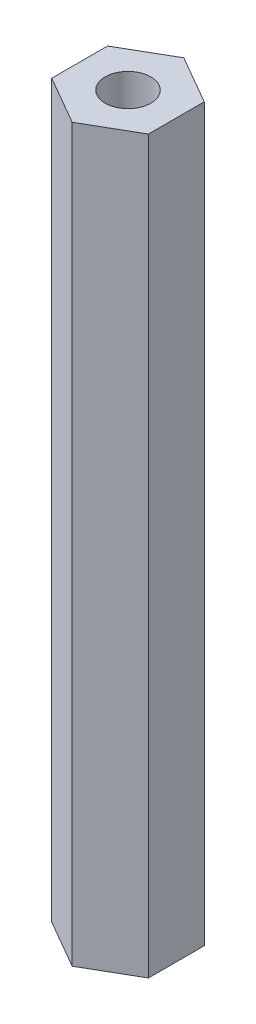
ISO-10303-21;
HEADER;
FILE_DESCRIPTION(('STEP AP214'),'2;1');
FILE_NAME('part.step','',(''),(''),'','','');
FILE_SCHEMA(('AUTOMOTIVE_DESIGN { 1 0 10303 214 1 1 1 1 }'));
ENDSEC;
DATA;
#1=APPLICATION_CONTEXT('core data for automotive mechanical design processes');
#2=APPLICATION_PROTOCOL_DEFINITION('international standard','automotive_design',2000,#1);
#3=PRODUCT_CONTEXT('',#1,'mechanical');
#4=PRODUCT('Part','Part','',(#3));
#5=PRODUCT_RELATED_PRODUCT_CATEGORY('part','',(#4));
#6=PRODUCT_DEFINITION_FORMATION('','',#4);
#7=PRODUCT_DEFINITION_CONTEXT('part definition',#1,'design');
#8=PRODUCT_DEFINITION('design','',#6,#7);
#9=PRODUCT_DEFINITION_SHAPE('','',#8);
#10=(LENGTH_UNIT() NAMED_UNIT(*) SI_UNIT(.MILLI.,.METRE.));
#11=(NAMED_UNIT(*) PLANE_ANGLE_UNIT() SI_UNIT($,.RADIAN.));
#12=(NAMED_UNIT(*) SI_UNIT($,.STERADIAN.) SOLID_ANGLE_UNIT());
#13=UNCERTAINTY_MEASURE_WITH_UNIT(LENGTH_MEASURE(1.E-05),#10,'distance_accuracy_value','');
#14=(GEOMETRIC_REPRESENTATION_CONTEXT(3) GLOBAL_UNCERTAINTY_ASSIGNED_CONTEXT((#13)) GLOBAL_UNIT_ASSIGNED_CONTEXT((#10,
#11,#12)) REPRESENTATION_CONTEXT('',''));
#15=CARTESIAN_POINT('',(0.,0.,0.));
#16=DIRECTION('',(0.,0.,1.));
#17=DIRECTION('',(1.,0.,0.));
#18=AXIS2_PLACEMENT_3D('',#15,#16,#17);
#19=CARTESIAN_POINT('',(3.17499999999997,48.,-1.8330871046771));
#20=DIRECTION('',(-0.499999999999995,0.,0.866025403784441));
#21=DIRECTION('',(0.866025403784442,0.,0.499999999999995));
#22=AXIS2_PLACEMENT_3D('',#19,#20,#21);
#23=PLANE('',#22);
#24=DIRECTION('',(-0.866025403784442,0.,-0.499999999999995));
#25=VECTOR('',#24,1.);
#26=CARTESIAN_POINT('',(3.17499999999997,0.,-1.8330871046771));
#27=LINE('',#26,#25);
#28=CARTESIAN_POINT('',(3.17499999999997,0.,-1.8330871046771));
#29=VERTEX_POINT('',#28);
#30=CARTESIAN_POINT('',(0.,0.,-3.66617420935412));
#31=VERTEX_POINT('',#30);
#32=EDGE_CURVE('E134',#29,#31,#27,.T.);
#33=ORIENTED_EDGE('',*,*,#32,.T.);
#34=DIRECTION('',(0.,-1.,0.));
#35=VECTOR('',#34,1.);
#36=CARTESIAN_POINT('',(0.,48.,-3.66617420935412));
#37=LINE('',#36,#35);
#38=CARTESIAN_POINT('',(0.,48.,-3.66617420935412));
#39=VERTEX_POINT('',#38);
#40=EDGE_CURVE('E11',#39,#31,#37,.T.);
#41=ORIENTED_EDGE('',*,*,#40,.F.);
#42=DIRECTION('',(-0.866025403784442,0.,-0.499999999999995));
#43=VECTOR('',#42,1.);
#44=CARTESIAN_POINT('',(3.17499999999997,48.,-1.8330871046771));
#45=LINE('',#44,#43);
#46=CARTESIAN_POINT('',(3.17499999999997,48.,-1.8330871046771));
#47=VERTEX_POINT('',#46);
#48=EDGE_CURVE('E151',#47,#39,#45,.T.);
#49=ORIENTED_EDGE('',*,*,#48,.F.);
#50=DIRECTION('',(0.,-1.,0.));
#51=VECTOR('',#50,1.);
#52=CARTESIAN_POINT('',(3.17499999999997,48.,-1.8330871046771));
#53=LINE('',#52,#51);
#54=EDGE_CURVE('E130',#47,#29,#53,.T.);
#55=ORIENTED_EDGE('',*,*,#54,.T.);
#56=EDGE_LOOP('',(#33,#41,#49,#55));
#57=FACE_BOUND('',#56,.T.);
#58=ADVANCED_FACE('F45',(#57),#23,.F.);
#59=CARTESIAN_POINT('',(0.,48.,-3.66617420935412));
#60=DIRECTION('',(0.500000000000001,0.,0.866025403784438));
#61=DIRECTION('',(0.866025403784438,0.,-0.500000000000001));
#62=AXIS2_PLACEMENT_3D('',#59,#60,#61);
#63=PLANE('',#62);
#64=DIRECTION('',(-0.866025403784438,0.,0.500000000000001));
#65=VECTOR('',#64,1.);
#66=CARTESIAN_POINT('',(0.,0.,-3.66617420935412));
#67=LINE('',#66,#65);
#68=CARTESIAN_POINT('',(-3.175,0.,-1.83308710467705));
#69=VERTEX_POINT('',#68);
#70=EDGE_CURVE('E138',#31,#69,#67,.T.);
#71=ORIENTED_EDGE('',*,*,#70,.T.);
#72=DIRECTION('',(0.,-1.,0.));
#73=VECTOR('',#72,1.);
#74=CARTESIAN_POINT('',(-3.175,48.,-1.83308710467705));
#75=LINE('',#74,#73);
#76=CARTESIAN_POINT('',(-3.175,48.,-1.83308710467705));
#77=VERTEX_POINT('',#76);
#78=EDGE_CURVE('E54',#77,#69,#75,.T.);
#79=ORIENTED_EDGE('',*,*,#78,.F.);
#80=DIRECTION('',(-0.866025403784438,0.,0.500000000000001));
#81=VECTOR('',#80,1.);
#82=CARTESIAN_POINT('',(0.,48.,-3.66617420935412));
#83=LINE('',#82,#81);
#84=EDGE_CURVE('E99',#39,#77,#83,.T.);
#85=ORIENTED_EDGE('',*,*,#84,.F.);
#86=ORIENTED_EDGE('',*,*,#40,.T.);
#87=EDGE_LOOP('',(#71,#79,#85,#86));
#88=FACE_BOUND('',#87,.T.);
#89=ADVANCED_FACE('F180',(#88),#63,.F.);
#90=CARTESIAN_POINT('',(-3.175,48.,-1.83308710467705));
#91=DIRECTION('',(1.,0.,0.));
#92=DIRECTION('',(0.,0.,-1.));
#93=AXIS2_PLACEMENT_3D('',#90,#91,#92);
#94=PLANE('',#93);
#95=DIRECTION('',(0.,0.,1.));
#96=VECTOR('',#95,1.);
#97=CARTESIAN_POINT('',(-3.175,0.,-1.83308710467705));
#98=LINE('',#97,#96);
#99=CARTESIAN_POINT('',(-3.17499999999999,0.,1.83308710467707));
#100=VERTEX_POINT('',#99);
#101=EDGE_CURVE('E142',#69,#100,#98,.T.);
#102=ORIENTED_EDGE('',*,*,#101,.T.);
#103=DIRECTION('',(0.,-1.,0.));
#104=VECTOR('',#103,1.);
#105=CARTESIAN_POINT('',(-3.17499999999999,48.,1.83308710467707));
#106=LINE('',#105,#104);
#107=CARTESIAN_POINT('',(-3.17499999999999,48.,1.83308710467707));
#108=VERTEX_POINT('',#107);
#109=EDGE_CURVE('E123',#108,#100,#106,.T.);
#110=ORIENTED_EDGE('',*,*,#109,.F.);
#111=DIRECTION('',(0.,0.,1.));
#112=VECTOR('',#111,1.);
#113=CARTESIAN_POINT('',(-3.175,48.,-1.83308710467705));
#114=LINE('',#113,#112);
#115=EDGE_CURVE('E112',#77,#108,#114,.T.);
#116=ORIENTED_EDGE('',*,*,#115,.F.);
#117=ORIENTED_EDGE('',*,*,#78,.T.);
#118=EDGE_LOOP('',(#102,#110,#116,#117));
#119=FACE_BOUND('',#118,.T.);
#120=ADVANCED_FACE('F161',(#119),#94,.F.);
#121=CARTESIAN_POINT('',(-3.17499999999999,48.,1.83308710467707));
#122=DIRECTION('',(0.499999999999995,0.,-0.866025403784442));
#123=DIRECTION('',(-0.866025403784442,0.,-0.499999999999995));
#124=AXIS2_PLACEMENT_3D('',#121,#122,#123);
#125=PLANE('',#124);
#126=DIRECTION('',(0.866025403784442,0.,0.499999999999995));
#127=VECTOR('',#126,1.);
#128=CARTESIAN_POINT('',(-3.17499999999999,0.,1.83308710467707));
#129=LINE('',#128,#127);
#130=CARTESIAN_POINT('',(0.,0.,3.66617420935412));
#131=VERTEX_POINT('',#130);
#132=EDGE_CURVE('E121',#100,#131,#129,.T.);
#133=ORIENTED_EDGE('',*,*,#132,.T.);
#134=DIRECTION('',(0.,-1.,0.));
#135=VECTOR('',#134,1.);
#136=CARTESIAN_POINT('',(0.,48.,3.66617420935412));
#137=LINE('',#136,#135);
#138=CARTESIAN_POINT('',(0.,48.,3.66617420935412));
#139=VERTEX_POINT('',#138);
#140=EDGE_CURVE('E118',#139,#131,#137,.T.);
#141=ORIENTED_EDGE('',*,*,#140,.F.);
#142=DIRECTION('',(0.866025403784442,0.,0.499999999999995));
#143=VECTOR('',#142,1.);
#144=CARTESIAN_POINT('',(-3.17499999999999,48.,1.83308710467707));
#145=LINE('',#144,#143);
#146=EDGE_CURVE('E106',#108,#139,#145,.T.);
#147=ORIENTED_EDGE('',*,*,#146,.F.);
#148=ORIENTED_EDGE('',*,*,#109,.T.);
#149=EDGE_LOOP('',(#133,#141,#147,#148));
#150=FACE_BOUND('',#149,.T.);
#151=ADVANCED_FACE('F119',(#150),#125,.F.);
#152=CARTESIAN_POINT('',(0.,48.,3.66617420935412));
#153=DIRECTION('',(-0.500000000000007,0.,-0.866025403784435));
#154=DIRECTION('',(-0.866025403784435,0.,0.500000000000007));
#155=AXIS2_PLACEMENT_3D('',#152,#153,#154);
#156=PLANE('',#155);
#157=DIRECTION('',(0.866025403784435,0.,-0.500000000000007));
#158=VECTOR('',#157,1.);
#159=CARTESIAN_POINT('',(0.,0.,3.66617420935412));
#160=LINE('',#159,#158);
#161=CARTESIAN_POINT('',(3.17500000000001,0.,1.83308710467703));
#162=VERTEX_POINT('',#161);
#163=EDGE_CURVE('E85',#131,#162,#160,.T.);
#164=ORIENTED_EDGE('',*,*,#163,.T.);
#165=DIRECTION('',(0.,-1.,0.));
#166=VECTOR('',#165,1.);
#167=CARTESIAN_POINT('',(3.17500000000001,48.,1.83308710467703));
#168=LINE('',#167,#166);
#169=CARTESIAN_POINT('',(3.17500000000001,48.,1.83308710467703));
#170=VERTEX_POINT('',#169);
#171=EDGE_CURVE('E124',#170,#162,#168,.T.);
#172=ORIENTED_EDGE('',*,*,#171,.F.);
#173=DIRECTION('',(0.866025403784435,0.,-0.500000000000007));
#174=VECTOR('',#173,1.);
#175=CARTESIAN_POINT('',(0.,48.,3.66617420935412));
#176=LINE('',#175,#174);
#177=EDGE_CURVE('E110',#139,#170,#176,.T.);
#178=ORIENTED_EDGE('',*,*,#177,.F.);
#179=ORIENTED_EDGE('',*,*,#140,.T.);
#180=EDGE_LOOP('',(#164,#172,#178,#179));
#181=FACE_BOUND('',#180,.T.);
#182=ADVANCED_FACE('F126',(#181),#156,.F.);
#183=CARTESIAN_POINT('',(3.17500000000001,48.,1.83308710467703));
#184=DIRECTION('',(-1.,0.,0.));
#185=DIRECTION('',(0.,0.,1.));
#186=AXIS2_PLACEMENT_3D('',#183,#184,#185);
#187=PLANE('',#186);
#188=DIRECTION('',(0.,0.,-1.));
#189=VECTOR('',#188,1.);
#190=CARTESIAN_POINT('',(3.17500000000001,0.,1.83308710467703));
#191=LINE('',#190,#189);
#192=EDGE_CURVE('E91',#162,#29,#191,.T.);
#193=ORIENTED_EDGE('',*,*,#192,.T.);
#194=ORIENTED_EDGE('',*,*,#54,.F.);
#195=DIRECTION('',(0.,0.,-1.));
#196=VECTOR('',#195,1.);
#197=CARTESIAN_POINT('',(3.17500000000001,48.,1.83308710467703));
#198=LINE('',#197,#196);
#199=EDGE_CURVE('E62',#170,#47,#198,.T.);
#200=ORIENTED_EDGE('',*,*,#199,.F.);
#201=ORIENTED_EDGE('',*,*,#171,.T.);
#202=EDGE_LOOP('',(#193,#194,#200,#201));
#203=FACE_BOUND('',#202,.T.);
#204=ADVANCED_FACE('F168',(#203),#187,.F.);
#205=CARTESIAN_POINT('',(0.,48.,0.));
#206=DIRECTION('',(0.,1.,0.));
#207=DIRECTION('',(0.,0.,1.));
#208=AXIS2_PLACEMENT_3D('',#205,#206,#207);
#209=PLANE('',#208);
#210=CARTESIAN_POINT('',(0.,48.,0.));
#211=DIRECTION('',(0.,1.,0.));
#212=DIRECTION('',(0.,0.,1.));
#213=AXIS2_PLACEMENT_3D('',#210,#211,#212);
#214=CIRCLE('',#213,1.5);
#215=CARTESIAN_POINT('',(0.,48.,1.5));
#216=VERTEX_POINT('',#215);
#217=EDGE_CURVE('E253',#216,#216,#214,.T.);
#218=ORIENTED_EDGE('',*,*,#217,.F.);
#219=EDGE_LOOP('',(#218));
#220=FACE_BOUND('',#219,.T.);
#221=ORIENTED_EDGE('',*,*,#48,.T.);
#222=ORIENTED_EDGE('',*,*,#84,.T.);
#223=ORIENTED_EDGE('',*,*,#115,.T.);
#224=ORIENTED_EDGE('',*,*,#146,.T.);
#225=ORIENTED_EDGE('',*,*,#177,.T.);
#226=ORIENTED_EDGE('',*,*,#199,.T.);
#227=EDGE_LOOP('',(#221,#222,#223,#224,#225,#226));
#228=FACE_BOUND('',#227,.T.);
#229=ADVANCED_FACE('F108',(#220,#228),#209,.T.);
#230=CARTESIAN_POINT('',(0.,0.,0.));
#231=DIRECTION('',(0.,1.,0.));
#232=DIRECTION('',(0.,0.,1.));
#233=AXIS2_PLACEMENT_3D('',#230,#231,#232);
#234=PLANE('',#233);
#235=CARTESIAN_POINT('',(0.,0.,0.));
#236=DIRECTION('',(0.,1.,0.));
#237=DIRECTION('',(0.,0.,1.));
#238=AXIS2_PLACEMENT_3D('',#235,#236,#237);
#239=CIRCLE('',#238,1.5);
#240=CARTESIAN_POINT('',(0.,0.,1.5));
#241=VERTEX_POINT('',#240);
#242=EDGE_CURVE('E249',#241,#241,#239,.T.);
#243=ORIENTED_EDGE('',*,*,#242,.T.);
#244=EDGE_LOOP('',(#243));
#245=FACE_BOUND('',#244,.T.);
#246=ORIENTED_EDGE('',*,*,#32,.F.);
#247=ORIENTED_EDGE('',*,*,#192,.F.);
#248=ORIENTED_EDGE('',*,*,#163,.F.);
#249=ORIENTED_EDGE('',*,*,#132,.F.);
#250=ORIENTED_EDGE('',*,*,#101,.F.);
#251=ORIENTED_EDGE('',*,*,#70,.F.);
#252=EDGE_LOOP('',(#246,#247,#248,#249,#250,#251));
#253=FACE_BOUND('',#252,.T.);
#254=ADVANCED_FACE('F164',(#245,#253),#234,.F.);
#255=CARTESIAN_POINT('',(0.,38.,0.));
#256=DIRECTION('',(0.,1.,0.));
#257=DIRECTION('',(0.,0.,1.));
#258=AXIS2_PLACEMENT_3D('',#255,#256,#257);
#259=CYLINDRICAL_SURFACE('',#258,1.5);
#260=CARTESIAN_POINT('',(0.,38.,0.));
#261=DIRECTION('',(0.,1.,0.));
#262=DIRECTION('',(0.,0.,1.));
#263=AXIS2_PLACEMENT_3D('',#260,#261,#262);
#264=CIRCLE('',#263,1.5);
#265=CARTESIAN_POINT('',(0.,38.,1.5));
#266=VERTEX_POINT('',#265);
#267=EDGE_CURVE('E139',#266,#266,#264,.T.);
#268=ORIENTED_EDGE('',*,*,#267,.F.);
#269=EDGE_LOOP('',(#268));
#270=FACE_BOUND('',#269,.T.);
#271=ORIENTED_EDGE('',*,*,#217,.T.);
#272=EDGE_LOOP('',(#271));
#273=FACE_BOUND('',#272,.T.);
#274=ADVANCED_FACE('F212',(#270,#273),#259,.F.);
#275=CARTESIAN_POINT('',(0.,38.,0.));
#276=DIRECTION('',(0.,1.,0.));
#277=DIRECTION('',(0.,0.,1.));
#278=AXIS2_PLACEMENT_3D('',#275,#276,#277);
#279=PLANE('',#278);
#280=ORIENTED_EDGE('',*,*,#267,.T.);
#281=EDGE_LOOP('',(#280));
#282=FACE_BOUND('',#281,.T.);
#283=ADVANCED_FACE('F220',(#282),#279,.T.);
#284=CARTESIAN_POINT('',(0.,0.,0.));
#285=DIRECTION('',(0.,1.,0.));
#286=DIRECTION('',(0.,0.,1.));
#287=AXIS2_PLACEMENT_3D('',#284,#285,#286);
#288=CYLINDRICAL_SURFACE('',#287,1.5);
#289=ORIENTED_EDGE('',*,*,#242,.F.);
#290=EDGE_LOOP('',(#289));
#291=FACE_BOUND('',#290,.T.);
#292=CARTESIAN_POINT('',(0.,10.,0.));
#293=DIRECTION('',(0.,1.,0.));
#294=DIRECTION('',(0.,0.,1.));
#295=AXIS2_PLACEMENT_3D('',#292,#293,#294);
#296=CIRCLE('',#295,1.5);
#297=CARTESIAN_POINT('',(0.,10.,1.5));
#298=VERTEX_POINT('',#297);
#299=EDGE_CURVE('E246',#298,#298,#296,.T.);
#300=ORIENTED_EDGE('',*,*,#299,.T.);
#301=EDGE_LOOP('',(#300));
#302=FACE_BOUND('',#301,.T.);
#303=ADVANCED_FACE('F227',(#291,#302),#288,.F.);
#304=CARTESIAN_POINT('',(0.,10.,0.));
#305=DIRECTION('',(0.,1.,0.));
#306=DIRECTION('',(0.,0.,1.));
#307=AXIS2_PLACEMENT_3D('',#304,#305,#306);
#308=PLANE('',#307);
#309=ORIENTED_EDGE('',*,*,#299,.F.);
#310=EDGE_LOOP('',(#309));
#311=FACE_BOUND('',#310,.T.);
#312=ADVANCED_FACE('F234',(#311),#308,.F.);
#313=CLOSED_SHELL('',(#58,#89,#120,#151,#182,#204,#229,#254,#274,#283,#303,#312));
#314=MANIFOLD_SOLID_BREP('B2',#313);
#315=ADVANCED_BREP_SHAPE_REPRESENTATION('',(#18,#314),#14);
#316=SHAPE_DEFINITION_REPRESENTATION(#9,#315);
ENDSEC;
END-ISO-10303-21;
